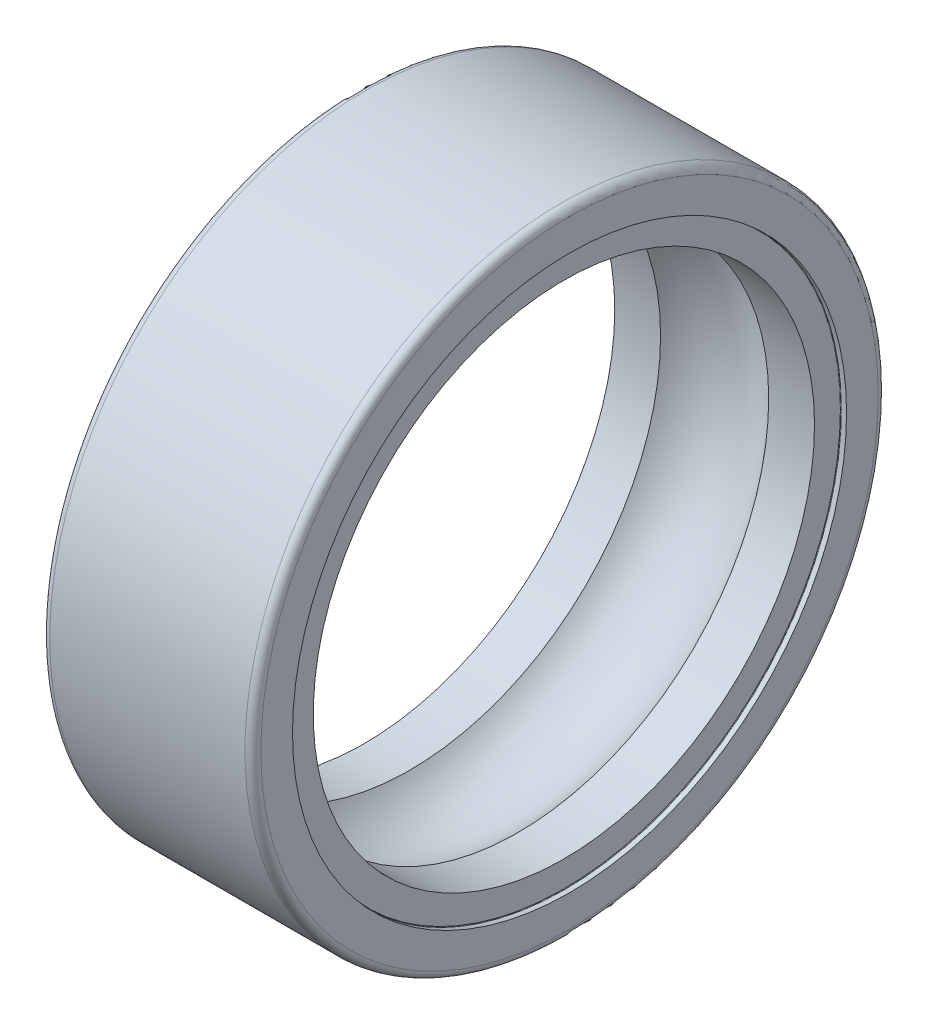
ISO-10303-21;
HEADER;
FILE_DESCRIPTION(('STEP AP214'),'2;1');
FILE_NAME('part.step','',(''),(''),'','','');
FILE_SCHEMA(('AUTOMOTIVE_DESIGN { 1 0 10303 214 1 1 1 1 }'));
ENDSEC;
DATA;
#1=APPLICATION_CONTEXT('core data for automotive mechanical design processes');
#2=APPLICATION_PROTOCOL_DEFINITION('international standard','automotive_design',2000,#1);
#3=PRODUCT_CONTEXT('',#1,'mechanical');
#4=PRODUCT('Part','Part','',(#3));
#5=PRODUCT_RELATED_PRODUCT_CATEGORY('part','',(#4));
#6=PRODUCT_DEFINITION_FORMATION('','',#4);
#7=PRODUCT_DEFINITION_CONTEXT('part definition',#1,'design');
#8=PRODUCT_DEFINITION('design','',#6,#7);
#9=PRODUCT_DEFINITION_SHAPE('','',#8);
#10=(LENGTH_UNIT() NAMED_UNIT(*) SI_UNIT(.MILLI.,.METRE.));
#11=(NAMED_UNIT(*) PLANE_ANGLE_UNIT() SI_UNIT($,.RADIAN.));
#12=(NAMED_UNIT(*) SI_UNIT($,.STERADIAN.) SOLID_ANGLE_UNIT());
#13=UNCERTAINTY_MEASURE_WITH_UNIT(LENGTH_MEASURE(1.E-05),#10,'distance_accuracy_value','');
#14=(GEOMETRIC_REPRESENTATION_CONTEXT(3) GLOBAL_UNCERTAINTY_ASSIGNED_CONTEXT((#13)) GLOBAL_UNIT_ASSIGNED_CONTEXT((#10,
#11,#12)) REPRESENTATION_CONTEXT('',''));
#15=CARTESIAN_POINT('',(0.,0.,0.));
#16=DIRECTION('',(0.,0.,1.));
#17=DIRECTION('',(1.,0.,0.));
#18=AXIS2_PLACEMENT_3D('',#15,#16,#17);
#19=CARTESIAN_POINT('',(-4.,11.7,0.));
#20=DIRECTION('',(-1.,0.,0.));
#21=DIRECTION('',(0.,0.,1.));
#22=AXIS2_PLACEMENT_3D('',#19,#20,#21);
#23=PLANE('',#22);
#24=CARTESIAN_POINT('',(-4.,0.,0.));
#25=DIRECTION('',(1.,0.,0.));
#26=DIRECTION('',(0.,0.,-1.));
#27=AXIS2_PLACEMENT_3D('',#24,#25,#26);
#28=CIRCLE('',#27,10.5);
#29=CARTESIAN_POINT('',(-4.,0.,-10.5));
#30=VERTEX_POINT('',#29);
#31=EDGE_CURVE('E62',#30,#30,#28,.T.);
#32=ORIENTED_EDGE('',*,*,#31,.T.);
#33=EDGE_LOOP('',(#32));
#34=FACE_BOUND('',#33,.T.);
#35=CARTESIAN_POINT('',(-4.,0.,0.));
#36=DIRECTION('',(1.,0.,0.));
#37=DIRECTION('',(0.,0.,-1.));
#38=AXIS2_PLACEMENT_3D('',#35,#36,#37);
#39=CIRCLE('',#38,11.7000000000001);
#40=CARTESIAN_POINT('',(-4.,0.,-11.7000000000001));
#41=VERTEX_POINT('',#40);
#42=EDGE_CURVE('E59',#41,#41,#39,.T.);
#43=ORIENTED_EDGE('',*,*,#42,.F.);
#44=EDGE_LOOP('',(#43));
#45=FACE_BOUND('',#44,.T.);
#46=ADVANCED_FACE('F15',(#34,#45),#23,.T.);
#47=CARTESIAN_POINT('',(4.,0.,0.));
#48=DIRECTION('',(1.,0.,0.));
#49=DIRECTION('',(0.,0.,-1.));
#50=AXIS2_PLACEMENT_3D('',#47,#48,#49);
#51=CYLINDRICAL_SURFACE('',#50,10.5);
#52=CARTESIAN_POINT('',(-3.8053658536585,0.,0.));
#53=DIRECTION('',(1.,0.,0.));
#54=DIRECTION('',(0.,0.,-1.));
#55=AXIS2_PLACEMENT_3D('',#52,#53,#54);
#56=CIRCLE('',#55,10.5);
#57=CARTESIAN_POINT('',(-3.8053658536585,0.,-10.5));
#58=VERTEX_POINT('',#57);
#59=EDGE_CURVE('E56',#58,#58,#56,.T.);
#60=ORIENTED_EDGE('',*,*,#59,.T.);
#61=EDGE_LOOP('',(#60));
#62=FACE_BOUND('',#61,.T.);
#63=ORIENTED_EDGE('',*,*,#31,.F.);
#64=EDGE_LOOP('',(#63));
#65=FACE_BOUND('',#64,.T.);
#66=ADVANCED_FACE('F68',(#62,#65),#51,.F.);
#67=CARTESIAN_POINT('',(-3.70000000000012,0.,0.));
#68=DIRECTION('',(1.,0.,0.));
#69=DIRECTION('',(0.,0.,-1.));
#70=AXIS2_PLACEMENT_3D('',#67,#68,#69);
#71=TOROIDAL_SURFACE('',#70,11.7000000000001,0.299999999999873);
#72=ORIENTED_EDGE('',*,*,#42,.T.);
#73=EDGE_LOOP('',(#72));
#74=FACE_BOUND('',#73,.T.);
#75=CARTESIAN_POINT('',(-3.7,0.,0.));
#76=DIRECTION('',(1.,0.,0.));
#77=DIRECTION('',(0.,0.,-1.));
#78=AXIS2_PLACEMENT_3D('',#75,#76,#77);
#79=CIRCLE('',#78,12.);
#80=CARTESIAN_POINT('',(-3.7,0.,-12.));
#81=VERTEX_POINT('',#80);
#82=EDGE_CURVE('E53',#81,#81,#79,.T.);
#83=ORIENTED_EDGE('',*,*,#82,.F.);
#84=EDGE_LOOP('',(#83));
#85=FACE_BOUND('',#84,.T.);
#86=ADVANCED_FACE('F70',(#74,#85),#71,.T.);
#87=CARTESIAN_POINT('',(-3.80536585365809,0.,0.));
#88=DIRECTION('',(1.,0.,0.));
#89=DIRECTION('',(0.,0.,-1.));
#90=AXIS2_PLACEMENT_3D('',#87,#88,#89);
#91=TOROIDAL_SURFACE('',#90,10.4800000000004,0.0199999999995985);
#92=ORIENTED_EDGE('',*,*,#59,.F.);
#93=EDGE_LOOP('',(#92));
#94=FACE_BOUND('',#93,.T.);
#95=CARTESIAN_POINT('',(-3.7853658536585,0.,0.));
#96=DIRECTION('',(1.,0.,0.));
#97=DIRECTION('',(0.,0.,-1.));
#98=AXIS2_PLACEMENT_3D('',#95,#96,#97);
#99=CIRCLE('',#98,10.4799999882672);
#100=CARTESIAN_POINT('',(-3.7853658536585,0.,-10.4799999882672));
#101=VERTEX_POINT('',#100);
#102=EDGE_CURVE('E50',#101,#101,#99,.T.);
#103=ORIENTED_EDGE('',*,*,#102,.T.);
#104=EDGE_LOOP('',(#103));
#105=FACE_BOUND('',#104,.T.);
#106=ADVANCED_FACE('F78',(#94,#105),#91,.F.);
#107=CARTESIAN_POINT('',(4.,0.,0.));
#108=DIRECTION('',(1.,0.,0.));
#109=DIRECTION('',(0.,0.,-1.));
#110=AXIS2_PLACEMENT_3D('',#107,#108,#109);
#111=CYLINDRICAL_SURFACE('',#110,12.);
#112=ORIENTED_EDGE('',*,*,#82,.T.);
#113=EDGE_LOOP('',(#112));
#114=FACE_BOUND('',#113,.T.);
#115=CARTESIAN_POINT('',(3.7,0.,0.));
#116=DIRECTION('',(1.,0.,0.));
#117=DIRECTION('',(0.,0.,-1.));
#118=AXIS2_PLACEMENT_3D('',#115,#116,#117);
#119=CIRCLE('',#118,12.);
#120=CARTESIAN_POINT('',(3.7,0.,-12.));
#121=VERTEX_POINT('',#120);
#122=EDGE_CURVE('E47',#121,#121,#119,.T.);
#123=ORIENTED_EDGE('',*,*,#122,.F.);
#124=EDGE_LOOP('',(#123));
#125=FACE_BOUND('',#124,.T.);
#126=ADVANCED_FACE('F85',(#114,#125),#111,.T.);
#127=CARTESIAN_POINT('',(-3.7853658536585,10.48,0.));
#128=DIRECTION('',(-1.,0.,0.));
#129=DIRECTION('',(0.,0.,1.));
#130=AXIS2_PLACEMENT_3D('',#127,#128,#129);
#131=PLANE('',#130);
#132=CARTESIAN_POINT('',(-3.7853658536585,0.,0.));
#133=DIRECTION('',(1.,0.,0.));
#134=DIRECTION('',(0.,0.,-1.));
#135=AXIS2_PLACEMENT_3D('',#132,#133,#134);
#136=CIRCLE('',#135,9.5);
#137=CARTESIAN_POINT('',(-3.7853658536585,0.,-9.5));
#138=VERTEX_POINT('',#137);
#139=EDGE_CURVE('E44',#138,#138,#136,.T.);
#140=ORIENTED_EDGE('',*,*,#139,.T.);
#141=EDGE_LOOP('',(#140));
#142=FACE_BOUND('',#141,.T.);
#143=ORIENTED_EDGE('',*,*,#102,.F.);
#144=EDGE_LOOP('',(#143));
#145=FACE_BOUND('',#144,.T.);
#146=ADVANCED_FACE('F89',(#142,#145),#131,.T.);
#147=CARTESIAN_POINT('',(3.70000000000012,0.,0.));
#148=DIRECTION('',(1.,0.,0.));
#149=DIRECTION('',(0.,0.,-1.));
#150=AXIS2_PLACEMENT_3D('',#147,#148,#149);
#151=TOROIDAL_SURFACE('',#150,11.7000000000001,0.299999999999874);
#152=ORIENTED_EDGE('',*,*,#122,.T.);
#153=EDGE_LOOP('',(#152));
#154=FACE_BOUND('',#153,.T.);
#155=CARTESIAN_POINT('',(4.,0.,0.));
#156=DIRECTION('',(1.,0.,0.));
#157=DIRECTION('',(0.,0.,-1.));
#158=AXIS2_PLACEMENT_3D('',#155,#156,#157);
#159=CIRCLE('',#158,11.7000000000001);
#160=CARTESIAN_POINT('',(4.,0.,-11.7000000000001));
#161=VERTEX_POINT('',#160);
#162=EDGE_CURVE('E41',#161,#161,#159,.T.);
#163=ORIENTED_EDGE('',*,*,#162,.F.);
#164=EDGE_LOOP('',(#163));
#165=FACE_BOUND('',#164,.T.);
#166=ADVANCED_FACE('F93',(#154,#165),#151,.T.);
#167=CARTESIAN_POINT('',(4.,0.,0.));
#168=DIRECTION('',(1.,0.,0.));
#169=DIRECTION('',(0.,0.,-1.));
#170=AXIS2_PLACEMENT_3D('',#167,#168,#169);
#171=CYLINDRICAL_SURFACE('',#170,9.5);
#172=CARTESIAN_POINT('',(-2.0493901531919,0.,0.));
#173=DIRECTION('',(1.,0.,0.));
#174=DIRECTION('',(0.,0.,-1.));
#175=AXIS2_PLACEMENT_3D('',#172,#173,#174);
#176=CIRCLE('',#175,9.5);
#177=CARTESIAN_POINT('',(-2.0493901531919,0.,-9.5));
#178=VERTEX_POINT('',#177);
#179=EDGE_CURVE('E38',#178,#178,#176,.T.);
#180=ORIENTED_EDGE('',*,*,#179,.T.);
#181=EDGE_LOOP('',(#180));
#182=FACE_BOUND('',#181,.T.);
#183=ORIENTED_EDGE('',*,*,#139,.F.);
#184=EDGE_LOOP('',(#183));
#185=FACE_BOUND('',#184,.T.);
#186=ADVANCED_FACE('F97',(#182,#185),#171,.F.);
#187=CARTESIAN_POINT('',(4.,10.5,0.));
#188=DIRECTION('',(1.,0.,0.));
#189=DIRECTION('',(0.,0.,-1.));
#190=AXIS2_PLACEMENT_3D('',#187,#188,#189);
#191=PLANE('',#190);
#192=ORIENTED_EDGE('',*,*,#162,.T.);
#193=EDGE_LOOP('',(#192));
#194=FACE_BOUND('',#193,.T.);
#195=CARTESIAN_POINT('',(4.,0.,0.));
#196=DIRECTION('',(1.,0.,0.));
#197=DIRECTION('',(0.,0.,-1.));
#198=AXIS2_PLACEMENT_3D('',#195,#196,#197);
#199=CIRCLE('',#198,10.5);
#200=CARTESIAN_POINT('',(4.,0.,-10.5));
#201=VERTEX_POINT('',#200);
#202=EDGE_CURVE('E35',#201,#201,#199,.T.);
#203=ORIENTED_EDGE('',*,*,#202,.F.);
#204=EDGE_LOOP('',(#203));
#205=FACE_BOUND('',#204,.T.);
#206=ADVANCED_FACE('F101',(#194,#205),#191,.T.);
#207=CARTESIAN_POINT('',(0.,0.,0.));
#208=DIRECTION('',(1.,0.,0.));
#209=DIRECTION('',(0.,0.,-1.));
#210=AXIS2_PLACEMENT_3D('',#207,#208,#209);
#211=TOROIDAL_SURFACE('',#210,7.9,2.59999999999996);
#212=ORIENTED_EDGE('',*,*,#179,.F.);
#213=EDGE_LOOP('',(#212));
#214=FACE_BOUND('',#213,.T.);
#215=CARTESIAN_POINT('',(2.0493901531919,0.,0.));
#216=DIRECTION('',(1.,0.,0.));
#217=DIRECTION('',(0.,0.,-1.));
#218=AXIS2_PLACEMENT_3D('',#215,#216,#217);
#219=CIRCLE('',#218,9.5);
#220=CARTESIAN_POINT('',(2.0493901531919,0.,-9.5));
#221=VERTEX_POINT('',#220);
#222=EDGE_CURVE('E30',#221,#221,#219,.T.);
#223=ORIENTED_EDGE('',*,*,#222,.T.);
#224=EDGE_LOOP('',(#223));
#225=FACE_BOUND('',#224,.T.);
#226=ADVANCED_FACE('F105',(#214,#225),#211,.F.);
#227=CARTESIAN_POINT('',(4.,0.,0.));
#228=DIRECTION('',(1.,0.,0.));
#229=DIRECTION('',(0.,0.,-1.));
#230=AXIS2_PLACEMENT_3D('',#227,#228,#229);
#231=CYLINDRICAL_SURFACE('',#230,10.5);
#232=ORIENTED_EDGE('',*,*,#202,.T.);
#233=EDGE_LOOP('',(#232));
#234=FACE_BOUND('',#233,.T.);
#235=CARTESIAN_POINT('',(3.8053658536585,0.,0.));
#236=DIRECTION('',(1.,0.,0.));
#237=DIRECTION('',(0.,0.,-1.));
#238=AXIS2_PLACEMENT_3D('',#235,#236,#237);
#239=CIRCLE('',#238,10.5);
#240=CARTESIAN_POINT('',(3.8053658536585,0.,-10.5));
#241=VERTEX_POINT('',#240);
#242=EDGE_CURVE('E26',#241,#241,#239,.T.);
#243=ORIENTED_EDGE('',*,*,#242,.F.);
#244=EDGE_LOOP('',(#243));
#245=FACE_BOUND('',#244,.T.);
#246=ADVANCED_FACE('F109',(#234,#245),#231,.F.);
#247=CARTESIAN_POINT('',(4.,0.,0.));
#248=DIRECTION('',(1.,0.,0.));
#249=DIRECTION('',(0.,0.,-1.));
#250=AXIS2_PLACEMENT_3D('',#247,#248,#249);
#251=CYLINDRICAL_SURFACE('',#250,9.5);
#252=CARTESIAN_POINT('',(3.7853658536585,0.,0.));
#253=DIRECTION('',(1.,0.,0.));
#254=DIRECTION('',(0.,0.,-1.));
#255=AXIS2_PLACEMENT_3D('',#252,#253,#254);
#256=CIRCLE('',#255,9.5);
#257=CARTESIAN_POINT('',(3.7853658536585,0.,-9.5));
#258=VERTEX_POINT('',#257);
#259=EDGE_CURVE('E22',#258,#258,#256,.T.);
#260=ORIENTED_EDGE('',*,*,#259,.T.);
#261=EDGE_LOOP('',(#260));
#262=FACE_BOUND('',#261,.T.);
#263=ORIENTED_EDGE('',*,*,#222,.F.);
#264=EDGE_LOOP('',(#263));
#265=FACE_BOUND('',#264,.T.);
#266=ADVANCED_FACE('F113',(#262,#265),#251,.F.);
#267=CARTESIAN_POINT('',(3.80536585365809,0.,0.));
#268=DIRECTION('',(1.,0.,0.));
#269=DIRECTION('',(0.,0.,-1.));
#270=AXIS2_PLACEMENT_3D('',#267,#268,#269);
#271=TOROIDAL_SURFACE('',#270,10.4800000000004,0.0199999999995963);
#272=CARTESIAN_POINT('',(3.7853658536585,0.,0.));
#273=DIRECTION('',(1.,0.,0.));
#274=DIRECTION('',(0.,0.,-1.));
#275=AXIS2_PLACEMENT_3D('',#272,#273,#274);
#276=CIRCLE('',#275,10.4799999928169);
#277=CARTESIAN_POINT('',(3.7853658536585,0.,-10.4799999928169));
#278=VERTEX_POINT('',#277);
#279=EDGE_CURVE('E10',#278,#278,#276,.T.);
#280=ORIENTED_EDGE('',*,*,#279,.F.);
#281=EDGE_LOOP('',(#280));
#282=FACE_BOUND('',#281,.T.);
#283=ORIENTED_EDGE('',*,*,#242,.T.);
#284=EDGE_LOOP('',(#283));
#285=FACE_BOUND('',#284,.T.);
#286=ADVANCED_FACE('F116',(#282,#285),#271,.F.);
#287=CARTESIAN_POINT('',(3.7853658536585,9.5,0.));
#288=DIRECTION('',(1.,0.,0.));
#289=DIRECTION('',(0.,0.,-1.));
#290=AXIS2_PLACEMENT_3D('',#287,#288,#289);
#291=PLANE('',#290);
#292=ORIENTED_EDGE('',*,*,#279,.T.);
#293=EDGE_LOOP('',(#292));
#294=FACE_BOUND('',#293,.T.);
#295=ORIENTED_EDGE('',*,*,#259,.F.);
#296=EDGE_LOOP('',(#295));
#297=FACE_BOUND('',#296,.T.);
#298=ADVANCED_FACE('F17',(#294,#297),#291,.T.);
#299=CLOSED_SHELL('',(#46,#66,#86,#106,#126,#146,#166,#186,#206,#226,#246,#266,#286,#298));
#300=MANIFOLD_SOLID_BREP('B1',#299);
#301=ADVANCED_BREP_SHAPE_REPRESENTATION('',(#18,#300),#14);
#302=SHAPE_DEFINITION_REPRESENTATION(#9,#301);
ENDSEC;
END-ISO-10303-21;
